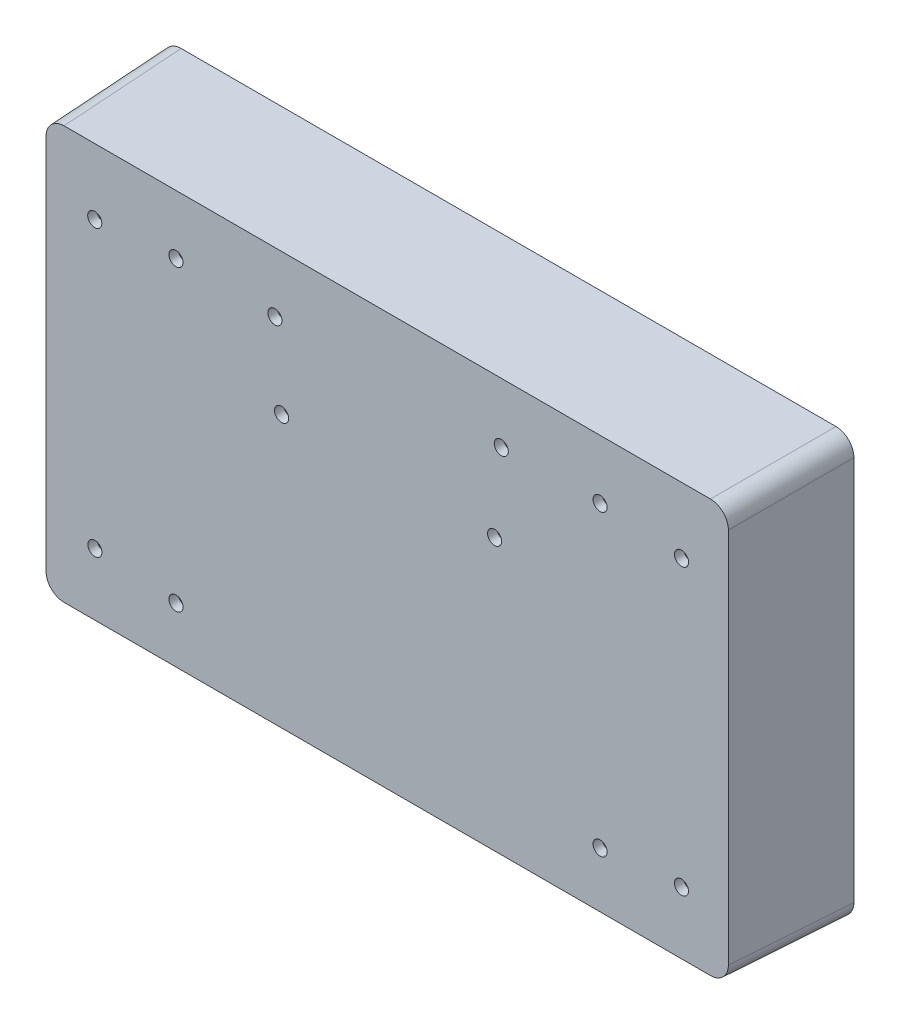
ISO-10303-21;
HEADER;
FILE_DESCRIPTION(('STEP AP214'),'2;1');
FILE_NAME('part.step','',(''),(''),'','','');
FILE_SCHEMA(('AUTOMOTIVE_DESIGN { 1 0 10303 214 1 1 1 1 }'));
ENDSEC;
DATA;
#1=APPLICATION_CONTEXT('core data for automotive mechanical design processes');
#2=APPLICATION_PROTOCOL_DEFINITION('international standard','automotive_design',2000,#1);
#3=PRODUCT_CONTEXT('',#1,'mechanical');
#4=PRODUCT('Part','Part','',(#3));
#5=PRODUCT_RELATED_PRODUCT_CATEGORY('part','',(#4));
#6=PRODUCT_DEFINITION_FORMATION('','',#4);
#7=PRODUCT_DEFINITION_CONTEXT('part definition',#1,'design');
#8=PRODUCT_DEFINITION('design','',#6,#7);
#9=PRODUCT_DEFINITION_SHAPE('','',#8);
#10=(LENGTH_UNIT() NAMED_UNIT(*) SI_UNIT(.MILLI.,.METRE.));
#11=(NAMED_UNIT(*) PLANE_ANGLE_UNIT() SI_UNIT($,.RADIAN.));
#12=(NAMED_UNIT(*) SI_UNIT($,.STERADIAN.) SOLID_ANGLE_UNIT());
#13=UNCERTAINTY_MEASURE_WITH_UNIT(LENGTH_MEASURE(1.E-05),#10,'distance_accuracy_value','');
#14=(GEOMETRIC_REPRESENTATION_CONTEXT(3) GLOBAL_UNCERTAINTY_ASSIGNED_CONTEXT((#13)) GLOBAL_UNIT_ASSIGNED_CONTEXT((#10,
#11,#12)) REPRESENTATION_CONTEXT('',''));
#15=CARTESIAN_POINT('',(0.,0.,0.));
#16=DIRECTION('',(0.,0.,1.));
#17=DIRECTION('',(1.,0.,0.));
#18=AXIS2_PLACEMENT_3D('',#15,#16,#17);
#19=CARTESIAN_POINT('',(0.,0.,-25.));
#20=DIRECTION('',(0.,0.,-1.));
#21=DIRECTION('',(-1.,0.,0.));
#22=AXIS2_PLACEMENT_3D('',#19,#20,#21);
#23=PLANE('',#22);
#24=DIRECTION('',(0.,-1.,0.));
#25=VECTOR('',#24,1.);
#26=CARTESIAN_POINT('',(-116.892916686668,62.4878318939366,-25.));
#27=LINE('',#26,#25);
#28=CARTESIAN_POINT('',(-116.892916686668,61.3645069117516,-25.));
#29=VERTEX_POINT('',#28);
#30=CARTESIAN_POINT('',(-116.892916686668,-24.3888431238783,-25.));
#31=VERTEX_POINT('',#30);
#32=EDGE_CURVE('E125',#29,#31,#27,.T.);
#33=ORIENTED_EDGE('',*,*,#32,.F.);
#34=CARTESIAN_POINT('',(-112.890478509472,61.3596320426327,-25.));
#35=DIRECTION('',(0.,0.,-1.));
#36=DIRECTION('',(0.707106781186548,-0.707106781186547,0.));
#37=AXIS2_PLACEMENT_3D('',#34,#35,#36);
#38=ELLIPSE('',#37,4.00487487002287,4.);
#39=CARTESIAN_POINT('',(-112.895353378591,65.362070219828,-25.));
#40=VERTEX_POINT('',#39);
#41=EDGE_CURVE('E107',#29,#40,#38,.T.);
#42=ORIENTED_EDGE('',*,*,#41,.T.);
#43=DIRECTION('',(-1.,0.,0.));
#44=VECTOR('',#43,1.);
#45=CARTESIAN_POINT('',(33.9813216392236,65.362070219828,-25.));
#46=LINE('',#45,#44);
#47=CARTESIAN_POINT('',(32.8579966570386,65.362070219828,-25.));
#48=VERTEX_POINT('',#47);
#49=EDGE_CURVE('E111',#48,#40,#46,.T.);
#50=ORIENTED_EDGE('',*,*,#49,.F.);
#51=CARTESIAN_POINT('',(32.8531217879197,61.3596320426327,-25.));
#52=DIRECTION('',(0.,0.,-1.));
#53=DIRECTION('',(-0.707106781186547,-0.707106781186548,0.));
#54=AXIS2_PLACEMENT_3D('',#51,#52,#53);
#55=ELLIPSE('',#54,4.00487487002287,4.);
#56=CARTESIAN_POINT('',(36.8555599651149,61.3645069117516,-25.));
#57=VERTEX_POINT('',#56);
#58=EDGE_CURVE('E91',#48,#57,#55,.T.);
#59=ORIENTED_EDGE('',*,*,#58,.T.);
#60=DIRECTION('',(0.,1.,0.));
#61=VECTOR('',#60,1.);
#62=CARTESIAN_POINT('',(36.8555599651149,62.4878318939367,-25.));
#63=LINE('',#62,#61);
#64=CARTESIAN_POINT('',(36.855559965115,-24.3888431238783,-25.));
#65=VERTEX_POINT('',#64);
#66=EDGE_CURVE('E100',#65,#57,#63,.T.);
#67=ORIENTED_EDGE('',*,*,#66,.F.);
#68=CARTESIAN_POINT('',(32.8531217879197,-24.3839682547594,-25.));
#69=DIRECTION('',(0.,0.,-1.));
#70=DIRECTION('',(-0.707106781186548,0.707106781186547,0.));
#71=AXIS2_PLACEMENT_3D('',#68,#69,#70);
#72=ELLIPSE('',#71,4.00487487002287,4.);
#73=CARTESIAN_POINT('',(32.8579966570386,-28.3864064319547,-25.));
#74=VERTEX_POINT('',#73);
#75=EDGE_CURVE('E65',#65,#74,#72,.T.);
#76=ORIENTED_EDGE('',*,*,#75,.T.);
#77=DIRECTION('',(1.,0.,0.));
#78=VECTOR('',#77,1.);
#79=CARTESIAN_POINT('',(33.9813216392236,-28.3864064319547,-25.));
#80=LINE('',#79,#78);
#81=CARTESIAN_POINT('',(-112.895353378591,-28.3864064319547,-25.));
#82=VERTEX_POINT('',#81);
#83=EDGE_CURVE('E123',#82,#74,#80,.T.);
#84=ORIENTED_EDGE('',*,*,#83,.F.);
#85=CARTESIAN_POINT('',(-112.890478509472,-24.3839682547594,-25.));
#86=DIRECTION('',(0.,0.,-1.));
#87=DIRECTION('',(0.707106781186547,0.707106781186548,0.));
#88=AXIS2_PLACEMENT_3D('',#85,#86,#87);
#89=ELLIPSE('',#88,4.00487487002287,4.);
#90=EDGE_CURVE('E116',#82,#31,#89,.T.);
#91=ORIENTED_EDGE('',*,*,#90,.T.);
#92=EDGE_LOOP('',(#33,#42,#50,#59,#67,#76,#84,#91));
#93=FACE_BOUND('',#92,.T.);
#94=CARTESIAN_POINT('',(-112.890478509472,61.3596320426327,-25.));
#95=DIRECTION('',(0.,0.,-1.));
#96=DIRECTION('',(0.707106781186548,-0.707106781186547,0.));
#97=AXIS2_PLACEMENT_3D('',#94,#95,#96);
#98=ELLIPSE('',#97,2.00243743501143,2.);
#99=CARTESIAN_POINT('',(-114.89169759807,61.3620694771921,-25.));
#100=VERTEX_POINT('',#99);
#101=CARTESIAN_POINT('',(-112.892915944032,63.3608511312303,-25.));
#102=VERTEX_POINT('',#101);
#103=EDGE_CURVE('E322',#100,#102,#98,.T.);
#104=ORIENTED_EDGE('',*,*,#103,.F.);
#105=DIRECTION('',(0.,-1.,0.));
#106=VECTOR('',#105,1.);
#107=CARTESIAN_POINT('',(-114.89169759807,62.4878318939366,-25.));
#108=LINE('',#107,#106);
#109=CARTESIAN_POINT('',(-114.89169759807,-24.3864056893188,-25.));
#110=VERTEX_POINT('',#109);
#111=EDGE_CURVE('E303',#100,#110,#108,.T.);
#112=ORIENTED_EDGE('',*,*,#111,.T.);
#113=CARTESIAN_POINT('',(-112.890478509472,-24.3839682547594,-25.));
#114=DIRECTION('',(0.,0.,-1.));
#115=DIRECTION('',(0.707106781186547,0.707106781186548,0.));
#116=AXIS2_PLACEMENT_3D('',#113,#114,#115);
#117=ELLIPSE('',#116,2.00243743501143,2.);
#118=CARTESIAN_POINT('',(-112.892915944032,-26.3851873433571,-25.));
#119=VERTEX_POINT('',#118);
#120=EDGE_CURVE('E316',#119,#110,#117,.T.);
#121=ORIENTED_EDGE('',*,*,#120,.F.);
#122=DIRECTION('',(1.,0.,0.));
#123=VECTOR('',#122,1.);
#124=CARTESIAN_POINT('',(33.9813216392236,-26.385187343357,-25.));
#125=LINE('',#124,#123);
#126=CARTESIAN_POINT('',(32.8555592224791,-26.385187343357,-25.));
#127=VERTEX_POINT('',#126);
#128=EDGE_CURVE('E56',#119,#127,#125,.T.);
#129=ORIENTED_EDGE('',*,*,#128,.T.);
#130=CARTESIAN_POINT('',(32.8531217879197,-24.3839682547594,-25.));
#131=DIRECTION('',(0.,0.,-1.));
#132=DIRECTION('',(-0.707106781186548,0.707106781186547,0.));
#133=AXIS2_PLACEMENT_3D('',#130,#131,#132);
#134=ELLIPSE('',#133,2.00243743501143,2.);
#135=CARTESIAN_POINT('',(34.8543408765173,-24.3864056893188,-25.));
#136=VERTEX_POINT('',#135);
#137=EDGE_CURVE('E318',#136,#127,#134,.T.);
#138=ORIENTED_EDGE('',*,*,#137,.F.);
#139=DIRECTION('',(0.,1.,0.));
#140=VECTOR('',#139,1.);
#141=CARTESIAN_POINT('',(34.8543408765173,62.4878318939367,-25.));
#142=LINE('',#141,#140);
#143=CARTESIAN_POINT('',(34.8543408765173,61.3620694771922,-25.));
#144=VERTEX_POINT('',#143);
#145=EDGE_CURVE('E336',#136,#144,#142,.T.);
#146=ORIENTED_EDGE('',*,*,#145,.T.);
#147=CARTESIAN_POINT('',(32.8531217879197,61.3596320426327,-25.));
#148=DIRECTION('',(0.,0.,-1.));
#149=DIRECTION('',(-0.707106781186547,-0.707106781186548,0.));
#150=AXIS2_PLACEMENT_3D('',#147,#148,#149);
#151=ELLIPSE('',#150,2.00243743501143,2.);
#152=CARTESIAN_POINT('',(32.8555592224791,63.3608511312303,-25.));
#153=VERTEX_POINT('',#152);
#154=EDGE_CURVE('E320',#153,#144,#151,.T.);
#155=ORIENTED_EDGE('',*,*,#154,.F.);
#156=DIRECTION('',(-1.,0.,0.));
#157=VECTOR('',#156,1.);
#158=CARTESIAN_POINT('',(33.9813216392236,63.3608511312303,-25.));
#159=LINE('',#158,#157);
#160=EDGE_CURVE('E297',#153,#102,#159,.T.);
#161=ORIENTED_EDGE('',*,*,#160,.T.);
#162=EDGE_LOOP('',(#104,#112,#121,#129,#138,#146,#155,#161));
#163=FACE_BOUND('',#162,.T.);
#164=ADVANCED_FACE('F39',(#93,#163),#23,.T.);
#165=CARTESIAN_POINT('',(7.36496173957907,51.2890967809271,0.));
#166=DIRECTION('',(0.,0.,1.));
#167=DIRECTION('',(1.,0.,0.));
#168=AXIS2_PLACEMENT_3D('',#165,#166,#167);
#169=CONICAL_SURFACE('',#168,1.5,0.0349065850398867);
#170=CARTESIAN_POINT('',(7.36496173957907,51.2890967809271,2.));
#171=DIRECTION('',(0.,0.,-1.));
#172=DIRECTION('',(-1.,0.,0.));
#173=AXIS2_PLACEMENT_3D('',#170,#171,#172);
#174=CIRCLE('',#173,1.5698415389835);
#175=CARTESIAN_POINT('',(5.79512020059557,51.2890967809271,2.));
#176=VERTEX_POINT('',#175);
#177=EDGE_CURVE('E43',#176,#176,#174,.F.);
#178=ORIENTED_EDGE('',*,*,#177,.T.);
#179=EDGE_LOOP('',(#178));
#180=FACE_BOUND('',#179,.T.);
#181=CARTESIAN_POINT('',(7.36496173957907,51.2890967809271,0.));
#182=DIRECTION('',(0.,0.,1.));
#183=DIRECTION('',(1.,0.,0.));
#184=AXIS2_PLACEMENT_3D('',#181,#182,#183);
#185=CIRCLE('',#184,1.5);
#186=CARTESIAN_POINT('',(8.86496173957907,51.2890967809271,0.));
#187=VERTEX_POINT('',#186);
#188=EDGE_CURVE('E350',#187,#187,#185,.T.);
#189=ORIENTED_EDGE('',*,*,#188,.F.);
#190=EDGE_LOOP('',(#189));
#191=FACE_BOUND('',#190,.T.);
#192=ADVANCED_FACE('F407',(#180,#191),#169,.F.);
#193=CARTESIAN_POINT('',(25.4912621339343,49.7762168707705,0.));
#194=DIRECTION('',(0.,0.,1.));
#195=DIRECTION('',(1.,0.,0.));
#196=AXIS2_PLACEMENT_3D('',#193,#194,#195);
#197=CONICAL_SURFACE('',#196,1.5,0.0349065850398867);
#198=CARTESIAN_POINT('',(25.4912621339343,49.7762168707705,2.));
#199=DIRECTION('',(0.,0.,-1.));
#200=DIRECTION('',(-1.,0.,0.));
#201=AXIS2_PLACEMENT_3D('',#198,#199,#200);
#202=CIRCLE('',#201,1.5698415389835);
#203=CARTESIAN_POINT('',(23.9214205949508,49.7762168707705,2.));
#204=VERTEX_POINT('',#203);
#205=EDGE_CURVE('E162',#204,#204,#202,.F.);
#206=ORIENTED_EDGE('',*,*,#205,.T.);
#207=EDGE_LOOP('',(#206));
#208=FACE_BOUND('',#207,.T.);
#209=CARTESIAN_POINT('',(25.4912621339343,49.7762168707705,0.));
#210=DIRECTION('',(0.,0.,1.));
#211=DIRECTION('',(1.,0.,0.));
#212=AXIS2_PLACEMENT_3D('',#209,#210,#211);
#213=CIRCLE('',#212,1.5);
#214=CARTESIAN_POINT('',(26.9912621339343,49.7762168707705,0.));
#215=VERTEX_POINT('',#214);
#216=EDGE_CURVE('E353',#215,#215,#213,.T.);
#217=ORIENTED_EDGE('',*,*,#216,.F.);
#218=EDGE_LOOP('',(#217));
#219=FACE_BOUND('',#218,.T.);
#220=ADVANCED_FACE('F411',(#208,#219),#197,.F.);
#221=CARTESIAN_POINT('',(25.4716632373435,-13.6234666523832,0.));
#222=DIRECTION('',(0.,0.,1.));
#223=DIRECTION('',(1.,0.,0.));
#224=AXIS2_PLACEMENT_3D('',#221,#222,#223);
#225=CONICAL_SURFACE('',#224,1.5,0.0349065850398867);
#226=CARTESIAN_POINT('',(25.4716632373435,-13.6234666523832,2.));
#227=DIRECTION('',(0.,0.,-1.));
#228=DIRECTION('',(-1.,0.,0.));
#229=AXIS2_PLACEMENT_3D('',#226,#227,#228);
#230=CIRCLE('',#229,1.5698415389835);
#231=CARTESIAN_POINT('',(23.90182169836,-13.6234666523832,2.));
#232=VERTEX_POINT('',#231);
#233=EDGE_CURVE('E160',#232,#232,#230,.F.);
#234=ORIENTED_EDGE('',*,*,#233,.T.);
#235=EDGE_LOOP('',(#234));
#236=FACE_BOUND('',#235,.T.);
#237=CARTESIAN_POINT('',(25.4716632373435,-13.6234666523832,0.));
#238=DIRECTION('',(0.,0.,1.));
#239=DIRECTION('',(1.,0.,0.));
#240=AXIS2_PLACEMENT_3D('',#237,#238,#239);
#241=CIRCLE('',#240,1.5);
#242=CARTESIAN_POINT('',(26.9716632373435,-13.6234666523832,0.));
#243=VERTEX_POINT('',#242);
#244=EDGE_CURVE('E358',#243,#243,#241,.T.);
#245=ORIENTED_EDGE('',*,*,#244,.F.);
#246=EDGE_LOOP('',(#245));
#247=FACE_BOUND('',#246,.T.);
#248=ADVANCED_FACE('F527',(#236,#247),#225,.F.);
#249=CARTESIAN_POINT('',(7.36496173957907,-15.1280482620583,0.));
#250=DIRECTION('',(0.,0.,1.));
#251=DIRECTION('',(1.,0.,0.));
#252=AXIS2_PLACEMENT_3D('',#249,#250,#251);
#253=CONICAL_SURFACE('',#252,1.5,0.0349065850398867);
#254=CARTESIAN_POINT('',(7.36496173957907,-15.1280482620583,2.));
#255=DIRECTION('',(0.,0.,-1.));
#256=DIRECTION('',(-1.,0.,0.));
#257=AXIS2_PLACEMENT_3D('',#254,#255,#256);
#258=CIRCLE('',#257,1.5698415389835);
#259=CARTESIAN_POINT('',(5.79512020059557,-15.1280482620583,2.));
#260=VERTEX_POINT('',#259);
#261=EDGE_CURVE('E157',#260,#260,#258,.F.);
#262=ORIENTED_EDGE('',*,*,#261,.T.);
#263=EDGE_LOOP('',(#262));
#264=FACE_BOUND('',#263,.T.);
#265=CARTESIAN_POINT('',(7.36496173957907,-15.1280482620583,0.));
#266=DIRECTION('',(0.,0.,1.));
#267=DIRECTION('',(1.,0.,0.));
#268=AXIS2_PLACEMENT_3D('',#265,#266,#267);
#269=CIRCLE('',#268,1.5);
#270=CARTESIAN_POINT('',(8.86496173957907,-15.1280482620583,0.));
#271=VERTEX_POINT('',#270);
#272=EDGE_CURVE('E361',#271,#271,#269,.T.);
#273=ORIENTED_EDGE('',*,*,#272,.F.);
#274=EDGE_LOOP('',(#273));
#275=FACE_BOUND('',#274,.T.);
#276=ADVANCED_FACE('F537',(#264,#275),#253,.F.);
#277=CARTESIAN_POINT('',(-14.6335821702918,51.078679059881,0.));
#278=DIRECTION('',(0.,0.,1.));
#279=DIRECTION('',(1.,0.,0.));
#280=AXIS2_PLACEMENT_3D('',#277,#278,#279);
#281=CONICAL_SURFACE('',#280,1.5,0.0349065850398867);
#282=CARTESIAN_POINT('',(-14.6335821702918,51.078679059881,2.));
#283=DIRECTION('',(0.,0.,-1.));
#284=DIRECTION('',(-1.,0.,0.));
#285=AXIS2_PLACEMENT_3D('',#282,#283,#284);
#286=CIRCLE('',#285,1.5698415389835);
#287=CARTESIAN_POINT('',(-16.2034237092753,51.078679059881,2.));
#288=VERTEX_POINT('',#287);
#289=EDGE_CURVE('E154',#288,#288,#286,.F.);
#290=ORIENTED_EDGE('',*,*,#289,.T.);
#291=EDGE_LOOP('',(#290));
#292=FACE_BOUND('',#291,.T.);
#293=CARTESIAN_POINT('',(-14.6335821702918,51.078679059881,0.));
#294=DIRECTION('',(0.,0.,1.));
#295=DIRECTION('',(1.,0.,0.));
#296=AXIS2_PLACEMENT_3D('',#293,#294,#295);
#297=CIRCLE('',#296,1.5);
#298=CARTESIAN_POINT('',(-13.1335821702918,51.078679059881,0.));
#299=VERTEX_POINT('',#298);
#300=EDGE_CURVE('E364',#299,#299,#297,.T.);
#301=ORIENTED_EDGE('',*,*,#300,.F.);
#302=EDGE_LOOP('',(#301));
#303=FACE_BOUND('',#302,.T.);
#304=ADVANCED_FACE('F548',(#292,#303),#281,.F.);
#305=CARTESIAN_POINT('',(-16.1161915234905,32.9981485892766,0.));
#306=DIRECTION('',(0.,0.,1.));
#307=DIRECTION('',(1.,0.,0.));
#308=AXIS2_PLACEMENT_3D('',#305,#306,#307);
#309=CONICAL_SURFACE('',#308,1.5,0.0349065850398867);
#310=CARTESIAN_POINT('',(-16.1161915234905,32.9981485892766,2.));
#311=DIRECTION('',(0.,0.,-1.));
#312=DIRECTION('',(-1.,0.,0.));
#313=AXIS2_PLACEMENT_3D('',#310,#311,#312);
#314=CIRCLE('',#313,1.5698415389835);
#315=CARTESIAN_POINT('',(-17.686033062474,32.9981485892766,2.));
#316=VERTEX_POINT('',#315);
#317=EDGE_CURVE('E151',#316,#316,#314,.F.);
#318=ORIENTED_EDGE('',*,*,#317,.T.);
#319=EDGE_LOOP('',(#318));
#320=FACE_BOUND('',#319,.T.);
#321=CARTESIAN_POINT('',(-16.1161915234905,32.9981485892766,0.));
#322=DIRECTION('',(0.,0.,1.));
#323=DIRECTION('',(1.,0.,0.));
#324=AXIS2_PLACEMENT_3D('',#321,#322,#323);
#325=CIRCLE('',#324,1.5);
#326=CARTESIAN_POINT('',(-14.6161915234905,32.9981485892766,0.));
#327=VERTEX_POINT('',#326);
#328=EDGE_CURVE('E367',#327,#327,#325,.T.);
#329=ORIENTED_EDGE('',*,*,#328,.F.);
#330=EDGE_LOOP('',(#329));
#331=FACE_BOUND('',#330,.T.);
#332=ADVANCED_FACE('F559',(#320,#331),#309,.F.);
#333=CARTESIAN_POINT('',(-65.0188938697197,51.078679059881,0.));
#334=DIRECTION('',(0.,0.,1.));
#335=DIRECTION('',(1.,0.,0.));
#336=AXIS2_PLACEMENT_3D('',#333,#334,#335);
#337=CONICAL_SURFACE('',#336,1.5,0.0349065850398867);
#338=CARTESIAN_POINT('',(-65.0188938697197,51.078679059881,2.));
#339=DIRECTION('',(0.,0.,-1.));
#340=DIRECTION('',(-1.,0.,0.));
#341=AXIS2_PLACEMENT_3D('',#338,#339,#340);
#342=CIRCLE('',#341,1.56984153898349);
#343=CARTESIAN_POINT('',(-66.5887354087032,51.078679059881,2.));
#344=VERTEX_POINT('',#343);
#345=EDGE_CURVE('E148',#344,#344,#342,.F.);
#346=ORIENTED_EDGE('',*,*,#345,.T.);
#347=EDGE_LOOP('',(#346));
#348=FACE_BOUND('',#347,.T.);
#349=CARTESIAN_POINT('',(-65.0188938697197,51.078679059881,0.));
#350=DIRECTION('',(0.,0.,1.));
#351=DIRECTION('',(1.,0.,0.));
#352=AXIS2_PLACEMENT_3D('',#349,#350,#351);
#353=CIRCLE('',#352,1.5);
#354=CARTESIAN_POINT('',(-63.5188938697197,51.078679059881,0.));
#355=VERTEX_POINT('',#354);
#356=EDGE_CURVE('E370',#355,#355,#353,.T.);
#357=ORIENTED_EDGE('',*,*,#356,.F.);
#358=EDGE_LOOP('',(#357));
#359=FACE_BOUND('',#358,.T.);
#360=ADVANCED_FACE('F570',(#348,#359),#337,.F.);
#361=CARTESIAN_POINT('',(-63.5349698763937,32.9981485892766,0.));
#362=DIRECTION('',(0.,0.,1.));
#363=DIRECTION('',(1.,0.,0.));
#364=AXIS2_PLACEMENT_3D('',#361,#362,#363);
#365=CONICAL_SURFACE('',#364,1.5,0.0349065850398867);
#366=CARTESIAN_POINT('',(-63.5349698763937,32.9981485892766,2.));
#367=DIRECTION('',(0.,0.,-1.));
#368=DIRECTION('',(-1.,0.,0.));
#369=AXIS2_PLACEMENT_3D('',#366,#367,#368);
#370=CIRCLE('',#369,1.5698415389835);
#371=CARTESIAN_POINT('',(-65.1048114153772,32.9981485892766,2.));
#372=VERTEX_POINT('',#371);
#373=EDGE_CURVE('E145',#372,#372,#370,.F.);
#374=ORIENTED_EDGE('',*,*,#373,.T.);
#375=EDGE_LOOP('',(#374));
#376=FACE_BOUND('',#375,.T.);
#377=CARTESIAN_POINT('',(-63.5349698763937,32.9981485892766,0.));
#378=DIRECTION('',(0.,0.,1.));
#379=DIRECTION('',(1.,0.,0.));
#380=AXIS2_PLACEMENT_3D('',#377,#378,#379);
#381=CIRCLE('',#380,1.5);
#382=CARTESIAN_POINT('',(-62.0349698763937,32.9981485892766,0.));
#383=VERTEX_POINT('',#382);
#384=EDGE_CURVE('E373',#383,#383,#381,.T.);
#385=ORIENTED_EDGE('',*,*,#384,.F.);
#386=EDGE_LOOP('',(#385));
#387=FACE_BOUND('',#386,.T.);
#388=ADVANCED_FACE('F581',(#376,#387),#365,.F.);
#389=CARTESIAN_POINT('',(-87.0371998457483,51.2890967809271,0.));
#390=DIRECTION('',(0.,0.,1.));
#391=DIRECTION('',(1.,0.,0.));
#392=AXIS2_PLACEMENT_3D('',#389,#390,#391);
#393=CONICAL_SURFACE('',#392,1.5,0.0349065850398867);
#394=CARTESIAN_POINT('',(-87.0371998457483,51.2890967809271,2.));
#395=DIRECTION('',(0.,0.,-1.));
#396=DIRECTION('',(-1.,0.,0.));
#397=AXIS2_PLACEMENT_3D('',#394,#395,#396);
#398=CIRCLE('',#397,1.56984153898349);
#399=CARTESIAN_POINT('',(-88.6070413847318,51.2890967809271,2.));
#400=VERTEX_POINT('',#399);
#401=EDGE_CURVE('E142',#400,#400,#398,.F.);
#402=ORIENTED_EDGE('',*,*,#401,.T.);
#403=EDGE_LOOP('',(#402));
#404=FACE_BOUND('',#403,.T.);
#405=CARTESIAN_POINT('',(-87.0371998457483,51.2890967809271,0.));
#406=DIRECTION('',(0.,0.,1.));
#407=DIRECTION('',(1.,0.,0.));
#408=AXIS2_PLACEMENT_3D('',#405,#406,#407);
#409=CIRCLE('',#408,1.5);
#410=CARTESIAN_POINT('',(-85.5371998457483,51.2890967809271,0.));
#411=VERTEX_POINT('',#410);
#412=EDGE_CURVE('E376',#411,#411,#409,.T.);
#413=ORIENTED_EDGE('',*,*,#412,.F.);
#414=EDGE_LOOP('',(#413));
#415=FACE_BOUND('',#414,.T.);
#416=ADVANCED_FACE('F592',(#404,#415),#393,.F.);
#417=CARTESIAN_POINT('',(-105.122155179384,49.7762168707705,0.));
#418=DIRECTION('',(0.,0.,1.));
#419=DIRECTION('',(1.,0.,0.));
#420=AXIS2_PLACEMENT_3D('',#417,#418,#419);
#421=CONICAL_SURFACE('',#420,1.5,0.0349065850398867);
#422=CARTESIAN_POINT('',(-105.122155179384,49.7762168707705,2.));
#423=DIRECTION('',(0.,0.,-1.));
#424=DIRECTION('',(-1.,0.,0.));
#425=AXIS2_PLACEMENT_3D('',#422,#423,#424);
#426=CIRCLE('',#425,1.56984153898349);
#427=CARTESIAN_POINT('',(-106.691996718367,49.7762168707705,2.));
#428=VERTEX_POINT('',#427);
#429=EDGE_CURVE('E139',#428,#428,#426,.F.);
#430=ORIENTED_EDGE('',*,*,#429,.T.);
#431=EDGE_LOOP('',(#430));
#432=FACE_BOUND('',#431,.T.);
#433=CARTESIAN_POINT('',(-105.122155179384,49.7762168707705,0.));
#434=DIRECTION('',(0.,0.,1.));
#435=DIRECTION('',(1.,0.,0.));
#436=AXIS2_PLACEMENT_3D('',#433,#434,#435);
#437=CIRCLE('',#436,1.5);
#438=CARTESIAN_POINT('',(-103.622155179384,49.7762168707705,0.));
#439=VERTEX_POINT('',#438);
#440=EDGE_CURVE('E379',#439,#439,#437,.T.);
#441=ORIENTED_EDGE('',*,*,#440,.F.);
#442=EDGE_LOOP('',(#441));
#443=FACE_BOUND('',#442,.T.);
#444=ADVANCED_FACE('F402',(#432,#443),#421,.F.);
#445=CARTESIAN_POINT('',(-87.0371998457483,-15.1280482620583,0.));
#446=DIRECTION('',(0.,0.,1.));
#447=DIRECTION('',(1.,0.,0.));
#448=AXIS2_PLACEMENT_3D('',#445,#446,#447);
#449=CONICAL_SURFACE('',#448,1.5,0.0349065850398867);
#450=CARTESIAN_POINT('',(-87.0371998457483,-15.1280482620583,2.));
#451=DIRECTION('',(0.,0.,-1.));
#452=DIRECTION('',(-1.,0.,0.));
#453=AXIS2_PLACEMENT_3D('',#450,#451,#452);
#454=CIRCLE('',#453,1.56984153898349);
#455=CARTESIAN_POINT('',(-88.6070413847318,-15.1280482620583,2.));
#456=VERTEX_POINT('',#455);
#457=EDGE_CURVE('E135',#456,#456,#454,.F.);
#458=ORIENTED_EDGE('',*,*,#457,.T.);
#459=EDGE_LOOP('',(#458));
#460=FACE_BOUND('',#459,.T.);
#461=CARTESIAN_POINT('',(-87.0371998457483,-15.1280482620583,0.));
#462=DIRECTION('',(0.,0.,1.));
#463=DIRECTION('',(1.,0.,0.));
#464=AXIS2_PLACEMENT_3D('',#461,#462,#463);
#465=CIRCLE('',#464,1.5);
#466=CARTESIAN_POINT('',(-85.5371998457483,-15.1280482620583,0.));
#467=VERTEX_POINT('',#466);
#468=EDGE_CURVE('E382',#467,#467,#465,.T.);
#469=ORIENTED_EDGE('',*,*,#468,.F.);
#470=EDGE_LOOP('',(#469));
#471=FACE_BOUND('',#470,.T.);
#472=ADVANCED_FACE('F393',(#460,#471),#449,.F.);
#473=CARTESIAN_POINT('',(-105.094004445807,-13.6234666523832,0.));
#474=DIRECTION('',(0.,0.,1.));
#475=DIRECTION('',(1.,0.,0.));
#476=AXIS2_PLACEMENT_3D('',#473,#474,#475);
#477=CONICAL_SURFACE('',#476,1.5,0.0349065850398867);
#478=CARTESIAN_POINT('',(-105.094004445807,-13.6234666523832,2.));
#479=DIRECTION('',(0.,0.,-1.));
#480=DIRECTION('',(-1.,0.,0.));
#481=AXIS2_PLACEMENT_3D('',#478,#479,#480);
#482=CIRCLE('',#481,1.56984153898349);
#483=CARTESIAN_POINT('',(-106.66384598479,-13.6234666523832,2.));
#484=VERTEX_POINT('',#483);
#485=EDGE_CURVE('E132',#484,#484,#482,.F.);
#486=ORIENTED_EDGE('',*,*,#485,.T.);
#487=EDGE_LOOP('',(#486));
#488=FACE_BOUND('',#487,.T.);
#489=CARTESIAN_POINT('',(-105.094004445807,-13.6234666523832,0.));
#490=DIRECTION('',(0.,0.,1.));
#491=DIRECTION('',(1.,0.,0.));
#492=AXIS2_PLACEMENT_3D('',#489,#490,#491);
#493=CIRCLE('',#492,1.5);
#494=CARTESIAN_POINT('',(-103.594004445807,-13.6234666523832,0.));
#495=VERTEX_POINT('',#494);
#496=EDGE_CURVE('E385',#495,#495,#493,.T.);
#497=ORIENTED_EDGE('',*,*,#496,.F.);
#498=EDGE_LOOP('',(#497));
#499=FACE_BOUND('',#498,.T.);
#500=ADVANCED_FACE('F391',(#488,#499),#477,.F.);
#501=CARTESIAN_POINT('',(35.9801032932618,62.4878318939367,0.0697989934050021));
#502=DIRECTION('',(0.999390827019096,0.,0.034899496702501));
#503=DIRECTION('',(0.034899496702501,0.,-0.999390827019096));
#504=AXIS2_PLACEMENT_3D('',#501,#502,#503);
#505=PLANE('',#504);
#506=ORIENTED_EDGE('',*,*,#66,.T.);
#507=DIRECTION('',(-0.0348782627423747,-0.0348782627423747,0.998782765958718));
#508=VECTOR('',#507,1.);
#509=CARTESIAN_POINT('',(35.9825347975761,60.4914817442127,0.000169820003353039));
#510=LINE('',#509,#508);
#511=CARTESIAN_POINT('',(35.9126991888378,60.4216461354744,2.));
#512=VERTEX_POINT('',#511);
#513=EDGE_CURVE('E106',#57,#512,#510,.T.);
#514=ORIENTED_EDGE('',*,*,#513,.T.);
#515=DIRECTION('',(0.,1.,0.));
#516=VECTOR('',#515,1.);
#517=CARTESIAN_POINT('',(35.9126991888377,62.4878318939367,2.));
#518=LINE('',#517,#516);
#519=CARTESIAN_POINT('',(35.9126991888378,-23.4459823476011,2.));
#520=VERTEX_POINT('',#519);
#521=EDGE_CURVE('E103',#520,#512,#518,.T.);
#522=ORIENTED_EDGE('',*,*,#521,.F.);
#523=DIRECTION('',(-0.0348782627423747,0.0348782627423747,0.998782765958718));
#524=VECTOR('',#523,1.);
#525=CARTESIAN_POINT('',(35.9825347975761,-23.5158179563394,0.000169820003353825));
#526=LINE('',#525,#524);
#527=EDGE_CURVE('E97',#520,#65,#526,.F.);
#528=ORIENTED_EDGE('',*,*,#527,.T.);
#529=EDGE_LOOP('',(#506,#514,#522,#528));
#530=FACE_BOUND('',#529,.T.);
#531=ADVANCED_FACE('F98',(#530),#505,.T.);
#532=CARTESIAN_POINT('',(33.9813216392236,-27.5109497601015,0.0697989934050021));
#533=DIRECTION('',(0.,-0.999390827019096,0.034899496702501));
#534=DIRECTION('',(0.,-0.034899496702501,-0.999390827019096));
#535=AXIS2_PLACEMENT_3D('',#532,#533,#534);
#536=PLANE('',#535);
#537=ORIENTED_EDGE('',*,*,#83,.T.);
#538=DIRECTION('',(-0.0348782627423747,0.0348782627423747,0.998782765958718));
#539=VECTOR('',#538,1.);
#540=CARTESIAN_POINT('',(31.9849714894997,-27.5133812644158,0.000169820003353066));
#541=LINE('',#540,#539);
#542=CARTESIAN_POINT('',(31.9151358807614,-27.4435456556775,2.));
#543=VERTEX_POINT('',#542);
#544=EDGE_CURVE('E11',#74,#543,#541,.T.);
#545=ORIENTED_EDGE('',*,*,#544,.T.);
#546=DIRECTION('',(1.,0.,0.));
#547=VECTOR('',#546,1.);
#548=CARTESIAN_POINT('',(33.9813216392236,-27.4435456556775,2.));
#549=LINE('',#548,#547);
#550=CARTESIAN_POINT('',(-111.952492602314,-27.4435456556775,2.));
#551=VERTEX_POINT('',#550);
#552=EDGE_CURVE('E112',#551,#543,#549,.T.);
#553=ORIENTED_EDGE('',*,*,#552,.F.);
#554=DIRECTION('',(0.0348782627423747,0.0348782627423747,0.998782765958718));
#555=VECTOR('',#554,1.);
#556=CARTESIAN_POINT('',(-111.915276808403,-27.4063298617663,3.06572090056577));
#557=LINE('',#556,#555);
#558=EDGE_CURVE('E48',#551,#82,#557,.F.);
#559=ORIENTED_EDGE('',*,*,#558,.T.);
#560=EDGE_LOOP('',(#537,#545,#553,#559));
#561=FACE_BOUND('',#560,.T.);
#562=ADVANCED_FACE('F400',(#561),#536,.T.);
#563=CARTESIAN_POINT('',(-116.017460014815,62.4878318939366,0.0697989934050021));
#564=DIRECTION('',(-0.999390827019096,0.,0.034899496702501));
#565=DIRECTION('',(0.034899496702501,0.,0.999390827019096));
#566=AXIS2_PLACEMENT_3D('',#563,#564,#565);
#567=PLANE('',#566);
#568=DIRECTION('',(0.,-1.,0.));
#569=VECTOR('',#568,1.);
#570=CARTESIAN_POINT('',(-115.950055910391,62.4878318939366,2.));
#571=LINE('',#570,#569);
#572=CARTESIAN_POINT('',(-115.950055910391,60.4216461354744,2.));
#573=VERTEX_POINT('',#572);
#574=CARTESIAN_POINT('',(-115.950055910391,-23.4459823476011,2.));
#575=VERTEX_POINT('',#574);
#576=EDGE_CURVE('E176',#573,#575,#571,.T.);
#577=ORIENTED_EDGE('',*,*,#576,.F.);
#578=DIRECTION('',(0.0348782627423747,-0.0348782627423747,0.998782765958718));
#579=VECTOR('',#578,1.);
#580=CARTESIAN_POINT('',(-115.839850523764,60.3114407488476,5.15586936458561));
#581=LINE('',#580,#579);
#582=EDGE_CURVE('E119',#573,#29,#581,.F.);
#583=ORIENTED_EDGE('',*,*,#582,.T.);
#584=ORIENTED_EDGE('',*,*,#32,.T.);
#585=DIRECTION('',(0.0348782627423747,0.0348782627423747,0.998782765958718));
#586=VECTOR('',#585,1.);
#587=CARTESIAN_POINT('',(-115.912840116479,-23.40876655369,3.06572090056578));
#588=LINE('',#587,#586);
#589=EDGE_CURVE('E184',#31,#575,#588,.T.);
#590=ORIENTED_EDGE('',*,*,#589,.T.);
#591=EDGE_LOOP('',(#577,#583,#584,#590));
#592=FACE_BOUND('',#591,.T.);
#593=ADVANCED_FACE('F678',(#592),#567,.T.);
#594=CARTESIAN_POINT('',(33.9813216392236,64.4866135479748,0.0697989934050021));
#595=DIRECTION('',(0.,0.999390827019096,0.034899496702501));
#596=DIRECTION('',(0.,-0.034899496702501,0.999390827019096));
#597=AXIS2_PLACEMENT_3D('',#594,#595,#596);
#598=PLANE('',#597);
#599=ORIENTED_EDGE('',*,*,#49,.T.);
#600=DIRECTION('',(0.0348782627423747,-0.0348782627423747,0.998782765958718));
#601=VECTOR('',#600,1.);
#602=CARTESIAN_POINT('',(-111.842287215687,64.309004056924,5.15586936458561));
#603=LINE('',#602,#601);
#604=CARTESIAN_POINT('',(-111.952492602314,64.4192094435508,2.));
#605=VERTEX_POINT('',#604);
#606=EDGE_CURVE('E192',#40,#605,#603,.T.);
#607=ORIENTED_EDGE('',*,*,#606,.T.);
#608=DIRECTION('',(-1.,0.,0.));
#609=VECTOR('',#608,1.);
#610=CARTESIAN_POINT('',(33.9813216392236,64.4192094435508,2.));
#611=LINE('',#610,#609);
#612=CARTESIAN_POINT('',(31.9151358807614,64.4192094435508,2.));
#613=VERTEX_POINT('',#612);
#614=EDGE_CURVE('E169',#613,#605,#611,.T.);
#615=ORIENTED_EDGE('',*,*,#614,.F.);
#616=DIRECTION('',(-0.0348782627423747,-0.0348782627423747,0.998782765958718));
#617=VECTOR('',#616,1.);
#618=CARTESIAN_POINT('',(31.9849714894997,64.4890450522891,0.00016982000335312));
#619=LINE('',#618,#617);
#620=EDGE_CURVE('E124',#613,#48,#619,.F.);
#621=ORIENTED_EDGE('',*,*,#620,.T.);
#622=EDGE_LOOP('',(#599,#607,#615,#621));
#623=FACE_BOUND('',#622,.T.);
#624=ADVANCED_FACE('F205',(#623),#598,.T.);
#625=CARTESIAN_POINT('',(0.,0.,2.));
#626=DIRECTION('',(0.,0.,-1.));
#627=DIRECTION('',(-1.,0.,0.));
#628=AXIS2_PLACEMENT_3D('',#625,#626,#627);
#629=PLANE('',#628);
#630=ORIENTED_EDGE('',*,*,#485,.F.);
#631=EDGE_LOOP('',(#630));
#632=FACE_BOUND('',#631,.T.);
#633=ORIENTED_EDGE('',*,*,#457,.F.);
#634=EDGE_LOOP('',(#633));
#635=FACE_BOUND('',#634,.T.);
#636=ORIENTED_EDGE('',*,*,#429,.F.);
#637=EDGE_LOOP('',(#636));
#638=FACE_BOUND('',#637,.T.);
#639=ORIENTED_EDGE('',*,*,#401,.F.);
#640=EDGE_LOOP('',(#639));
#641=FACE_BOUND('',#640,.T.);
#642=ORIENTED_EDGE('',*,*,#373,.F.);
#643=EDGE_LOOP('',(#642));
#644=FACE_BOUND('',#643,.T.);
#645=ORIENTED_EDGE('',*,*,#345,.F.);
#646=EDGE_LOOP('',(#645));
#647=FACE_BOUND('',#646,.T.);
#648=ORIENTED_EDGE('',*,*,#317,.F.);
#649=EDGE_LOOP('',(#648));
#650=FACE_BOUND('',#649,.T.);
#651=ORIENTED_EDGE('',*,*,#289,.F.);
#652=EDGE_LOOP('',(#651));
#653=FACE_BOUND('',#652,.T.);
#654=ORIENTED_EDGE('',*,*,#261,.F.);
#655=EDGE_LOOP('',(#654));
#656=FACE_BOUND('',#655,.T.);
#657=ORIENTED_EDGE('',*,*,#233,.F.);
#658=EDGE_LOOP('',(#657));
#659=FACE_BOUND('',#658,.T.);
#660=ORIENTED_EDGE('',*,*,#205,.F.);
#661=EDGE_LOOP('',(#660));
#662=FACE_BOUND('',#661,.T.);
#663=ORIENTED_EDGE('',*,*,#177,.F.);
#664=EDGE_LOOP('',(#663));
#665=FACE_BOUND('',#664,.T.);
#666=ORIENTED_EDGE('',*,*,#614,.T.);
#667=CARTESIAN_POINT('',(-111.947617733195,60.4167712663555,2.));
#668=DIRECTION('',(0.,0.,-1.));
#669=DIRECTION('',(0.707106781186548,-0.707106781186547,0.));
#670=AXIS2_PLACEMENT_3D('',#667,#668,#669);
#671=ELLIPSE('',#670,4.00487487002287,4.);
#672=EDGE_CURVE('E181',#605,#573,#671,.F.);
#673=ORIENTED_EDGE('',*,*,#672,.T.);
#674=ORIENTED_EDGE('',*,*,#576,.T.);
#675=CARTESIAN_POINT('',(-111.947617733195,-23.4411074784822,2.));
#676=DIRECTION('',(0.,0.,-1.));
#677=DIRECTION('',(0.707106781186547,0.707106781186548,0.));
#678=AXIS2_PLACEMENT_3D('',#675,#676,#677);
#679=ELLIPSE('',#678,4.00487487002287,4.);
#680=EDGE_CURVE('E188',#575,#551,#679,.F.);
#681=ORIENTED_EDGE('',*,*,#680,.T.);
#682=ORIENTED_EDGE('',*,*,#552,.T.);
#683=CARTESIAN_POINT('',(31.9102610116425,-23.4411074784822,2.));
#684=DIRECTION('',(0.,0.,-1.));
#685=DIRECTION('',(-0.707106781186548,0.707106781186547,0.));
#686=AXIS2_PLACEMENT_3D('',#683,#684,#685);
#687=ELLIPSE('',#686,4.00487487002287,4.);
#688=EDGE_CURVE('E191',#543,#520,#687,.F.);
#689=ORIENTED_EDGE('',*,*,#688,.T.);
#690=ORIENTED_EDGE('',*,*,#521,.T.);
#691=CARTESIAN_POINT('',(31.9102610116425,60.4167712663555,2.));
#692=DIRECTION('',(0.,0.,-1.));
#693=DIRECTION('',(-0.707106781186547,-0.707106781186548,0.));
#694=AXIS2_PLACEMENT_3D('',#691,#692,#693);
#695=ELLIPSE('',#694,4.00487487002287,4.);
#696=EDGE_CURVE('E185',#512,#613,#695,.F.);
#697=ORIENTED_EDGE('',*,*,#696,.T.);
#698=EDGE_LOOP('',(#666,#673,#674,#681,#682,#689,#690,#697));
#699=FACE_BOUND('',#698,.T.);
#700=ADVANCED_FACE('F659',(#632,#635,#638,#641,#644,#647,#650,#653,#656,#659,#662,#665,#699),
#629,.F.);
#701=CARTESIAN_POINT('',(-111.842287215687,60.3114407488476,5.01627137777561));
#702=DIRECTION('',(0.0348782627423747,-0.0348782627423747,0.998782765958718));
#703=DIRECTION('',(0.999390827019096,0.,-0.0348994967025011));
#704=AXIS2_PLACEMENT_3D('',#701,#702,#703);
#705=CYLINDRICAL_SURFACE('',#704,4.);
#706=ORIENTED_EDGE('',*,*,#41,.F.);
#707=ORIENTED_EDGE('',*,*,#582,.F.);
#708=ORIENTED_EDGE('',*,*,#672,.F.);
#709=ORIENTED_EDGE('',*,*,#606,.F.);
#710=EDGE_LOOP('',(#706,#707,#708,#709));
#711=FACE_BOUND('',#710,.T.);
#712=ADVANCED_FACE('F650',(#711),#705,.T.);
#713=CARTESIAN_POINT('',(31.9849714894997,60.4914817442127,-0.139428166806651));
#714=DIRECTION('',(-0.0348782627423747,-0.0348782627423747,0.998782765958718));
#715=DIRECTION('',(0.,-0.999390827019096,-0.0348994967025011));
#716=AXIS2_PLACEMENT_3D('',#713,#714,#715);
#717=CYLINDRICAL_SURFACE('',#716,4.);
#718=ORIENTED_EDGE('',*,*,#58,.F.);
#719=ORIENTED_EDGE('',*,*,#620,.F.);
#720=ORIENTED_EDGE('',*,*,#696,.F.);
#721=ORIENTED_EDGE('',*,*,#513,.F.);
#722=EDGE_LOOP('',(#718,#719,#720,#721));
#723=FACE_BOUND('',#722,.T.);
#724=ADVANCED_FACE('F211',(#723),#717,.T.);
#725=CARTESIAN_POINT('',(31.9849714894997,-23.5158179563394,-0.139428166806651));
#726=DIRECTION('',(-0.0348782627423747,0.0348782627423747,0.998782765958718));
#727=DIRECTION('',(0.999390827019096,0.,0.0348994967025011));
#728=AXIS2_PLACEMENT_3D('',#725,#726,#727);
#729=CYLINDRICAL_SURFACE('',#728,4.);
#730=ORIENTED_EDGE('',*,*,#75,.F.);
#731=ORIENTED_EDGE('',*,*,#527,.F.);
#732=ORIENTED_EDGE('',*,*,#688,.F.);
#733=ORIENTED_EDGE('',*,*,#544,.F.);
#734=EDGE_LOOP('',(#730,#731,#732,#733));
#735=FACE_BOUND('',#734,.T.);
#736=ADVANCED_FACE('F115',(#735),#729,.T.);
#737=CARTESIAN_POINT('',(-111.915276808403,-23.4087665536899,2.92612291375577));
#738=DIRECTION('',(0.0348782627423747,0.0348782627423747,0.998782765958718));
#739=DIRECTION('',(0.,-0.999390827019096,0.0348994967025011));
#740=AXIS2_PLACEMENT_3D('',#737,#738,#739);
#741=CYLINDRICAL_SURFACE('',#740,4.);
#742=ORIENTED_EDGE('',*,*,#90,.F.);
#743=ORIENTED_EDGE('',*,*,#558,.F.);
#744=ORIENTED_EDGE('',*,*,#680,.F.);
#745=ORIENTED_EDGE('',*,*,#589,.F.);
#746=EDGE_LOOP('',(#742,#743,#744,#745));
#747=FACE_BOUND('',#746,.T.);
#748=ADVANCED_FACE('F41',(#747),#741,.T.);
#749=CARTESIAN_POINT('',(33.9813216392236,62.4878318939367,0.));
#750=DIRECTION('',(0.999390827019096,0.,0.034899496702501));
#751=DIRECTION('',(0.034899496702501,0.,-0.999390827019096));
#752=AXIS2_PLACEMENT_3D('',#749,#750,#751);
#753=PLANE('',#752);
#754=ORIENTED_EDGE('',*,*,#145,.F.);
#755=DIRECTION('',(-0.0348782627423747,0.0348782627423747,0.998782765958718));
#756=VECTOR('',#755,1.);
#757=CARTESIAN_POINT('',(33.8767017408884,-23.4087665536899,2.99592190716077));
#758=LINE('',#757,#756);
#759=CARTESIAN_POINT('',(33.9813216392236,-23.5133864520252,0.));
#760=VERTEX_POINT('',#759);
#761=EDGE_CURVE('E324',#760,#136,#758,.F.);
#762=ORIENTED_EDGE('',*,*,#761,.F.);
#763=DIRECTION('',(0.,1.,0.));
#764=VECTOR('',#763,1.);
#765=CARTESIAN_POINT('',(33.9813216392236,62.4878318939367,0.));
#766=LINE('',#765,#764);
#767=CARTESIAN_POINT('',(33.9813216392236,60.4890502398985,0.));
#768=VERTEX_POINT('',#767);
#769=EDGE_CURVE('E293',#760,#768,#766,.T.);
#770=ORIENTED_EDGE('',*,*,#769,.T.);
#771=DIRECTION('',(-0.0348782627423747,-0.0348782627423747,0.998782765958718));
#772=VECTOR('',#771,1.);
#773=CARTESIAN_POINT('',(33.9837531435379,60.4914817442127,-0.0696291734016491));
#774=LINE('',#773,#772);
#775=EDGE_CURVE('E278',#144,#768,#774,.T.);
#776=ORIENTED_EDGE('',*,*,#775,.F.);
#777=EDGE_LOOP('',(#754,#762,#770,#776));
#778=FACE_BOUND('',#777,.T.);
#779=ADVANCED_FACE('F348',(#778),#753,.F.);
#780=CARTESIAN_POINT('',(33.9813216392236,-25.5121681060633,0.));
#781=DIRECTION('',(0.,-0.999390827019096,0.034899496702501));
#782=DIRECTION('',(0.,-0.034899496702501,-0.999390827019096));
#783=AXIS2_PLACEMENT_3D('',#780,#781,#782);
#784=PLANE('',#783);
#785=ORIENTED_EDGE('',*,*,#128,.F.);
#786=DIRECTION('',(0.0348782627423747,0.0348782627423747,0.998782765958718));
#787=VECTOR('',#786,1.);
#788=CARTESIAN_POINT('',(-111.842287215687,-25.3345586150126,5.08607037118061));
#789=LINE('',#788,#787);
#790=CARTESIAN_POINT('',(-112.019896706738,-25.5121681060634,0.));
#791=VERTEX_POINT('',#790);
#792=EDGE_CURVE('E327',#791,#119,#789,.F.);
#793=ORIENTED_EDGE('',*,*,#792,.F.);
#794=DIRECTION('',(1.,0.,0.));
#795=VECTOR('',#794,1.);
#796=CARTESIAN_POINT('',(33.9813216392236,-25.5121681060633,0.));
#797=LINE('',#796,#795);
#798=CARTESIAN_POINT('',(31.9825399851854,-25.5121681060633,0.));
#799=VERTEX_POINT('',#798);
#800=EDGE_CURVE('E334',#791,#799,#797,.T.);
#801=ORIENTED_EDGE('',*,*,#800,.T.);
#802=DIRECTION('',(-0.0348782627423747,0.0348782627423747,0.998782765958718));
#803=VECTOR('',#802,1.);
#804=CARTESIAN_POINT('',(31.9849714894997,-25.5145996103776,-0.0696291734016491));
#805=LINE('',#804,#803);
#806=EDGE_CURVE('E136',#127,#799,#805,.T.);
#807=ORIENTED_EDGE('',*,*,#806,.F.);
#808=EDGE_LOOP('',(#785,#793,#801,#807));
#809=FACE_BOUND('',#808,.T.);
#810=ADVANCED_FACE('F335',(#809),#784,.F.);
#811=CARTESIAN_POINT('',(-114.018678360776,62.4878318939366,0.));
#812=DIRECTION('',(-0.999390827019096,0.,0.034899496702501));
#813=DIRECTION('',(0.034899496702501,0.,0.999390827019096));
#814=AXIS2_PLACEMENT_3D('',#811,#812,#813);
#815=PLANE('',#814);
#816=DIRECTION('',(0.,-1.,0.));
#817=VECTOR('',#816,1.);
#818=CARTESIAN_POINT('',(-114.018678360776,62.4878318939366,0.));
#819=LINE('',#818,#817);
#820=CARTESIAN_POINT('',(-114.018678360776,60.4890502398984,0.));
#821=VERTEX_POINT('',#820);
#822=CARTESIAN_POINT('',(-114.018678360776,-23.5133864520252,0.));
#823=VERTEX_POINT('',#822);
#824=EDGE_CURVE('E292',#821,#823,#819,.T.);
#825=ORIENTED_EDGE('',*,*,#824,.T.);
#826=DIRECTION('',(0.0348782627423747,0.0348782627423747,0.998782765958718));
#827=VECTOR('',#826,1.);
#828=CARTESIAN_POINT('',(-113.914058462441,-23.4087665536899,2.99592190716077));
#829=LINE('',#828,#827);
#830=EDGE_CURVE('E311',#110,#823,#829,.T.);
#831=ORIENTED_EDGE('',*,*,#830,.F.);
#832=ORIENTED_EDGE('',*,*,#111,.F.);
#833=DIRECTION('',(0.0348782627423747,-0.0348782627423747,0.998782765958718));
#834=VECTOR('',#833,1.);
#835=CARTESIAN_POINT('',(-114.021109865091,60.4914817442127,-0.0696291734016491));
#836=LINE('',#835,#834);
#837=EDGE_CURVE('E314',#821,#100,#836,.F.);
#838=ORIENTED_EDGE('',*,*,#837,.F.);
#839=EDGE_LOOP('',(#825,#831,#832,#838));
#840=FACE_BOUND('',#839,.T.);
#841=ADVANCED_FACE('F428',(#840),#815,.F.);
#842=CARTESIAN_POINT('',(33.9813216392236,62.4878318939367,0.));
#843=DIRECTION('',(0.,0.999390827019096,0.034899496702501));
#844=DIRECTION('',(0.,-0.034899496702501,0.999390827019096));
#845=AXIS2_PLACEMENT_3D('',#842,#843,#844);
#846=PLANE('',#845);
#847=ORIENTED_EDGE('',*,*,#160,.F.);
#848=DIRECTION('',(-0.0348782627423747,-0.0348782627423747,0.998782765958718));
#849=VECTOR('',#848,1.);
#850=CARTESIAN_POINT('',(31.9849714894997,62.4902633982509,-0.0696291734016491));
#851=LINE('',#850,#849);
#852=CARTESIAN_POINT('',(31.9825399851854,62.4878318939367,0.));
#853=VERTEX_POINT('',#852);
#854=EDGE_CURVE('E275',#853,#153,#851,.F.);
#855=ORIENTED_EDGE('',*,*,#854,.F.);
#856=DIRECTION('',(-1.,0.,0.));
#857=VECTOR('',#856,1.);
#858=CARTESIAN_POINT('',(33.9813216392236,62.4878318939367,0.));
#859=LINE('',#858,#857);
#860=CARTESIAN_POINT('',(-112.019896706738,62.4878318939366,0.));
#861=VERTEX_POINT('',#860);
#862=EDGE_CURVE('E286',#853,#861,#859,.T.);
#863=ORIENTED_EDGE('',*,*,#862,.T.);
#864=DIRECTION('',(0.0348782627423747,-0.0348782627423747,0.998782765958718));
#865=VECTOR('',#864,1.);
#866=CARTESIAN_POINT('',(-111.842287215687,62.3102224028858,5.08607037118061));
#867=LINE('',#866,#865);
#868=EDGE_CURVE('E299',#102,#861,#867,.T.);
#869=ORIENTED_EDGE('',*,*,#868,.F.);
#870=EDGE_LOOP('',(#847,#855,#863,#869));
#871=FACE_BOUND('',#870,.T.);
#872=ADVANCED_FACE('F295',(#871),#846,.F.);
#873=CARTESIAN_POINT('',(0.,0.,0.));
#874=DIRECTION('',(0.,0.,-1.));
#875=DIRECTION('',(-1.,0.,0.));
#876=AXIS2_PLACEMENT_3D('',#873,#874,#875);
#877=PLANE('',#876);
#878=ORIENTED_EDGE('',*,*,#496,.T.);
#879=EDGE_LOOP('',(#878));
#880=FACE_BOUND('',#879,.T.);
#881=ORIENTED_EDGE('',*,*,#468,.T.);
#882=EDGE_LOOP('',(#881));
#883=FACE_BOUND('',#882,.T.);
#884=ORIENTED_EDGE('',*,*,#440,.T.);
#885=EDGE_LOOP('',(#884));
#886=FACE_BOUND('',#885,.T.);
#887=ORIENTED_EDGE('',*,*,#412,.T.);
#888=EDGE_LOOP('',(#887));
#889=FACE_BOUND('',#888,.T.);
#890=ORIENTED_EDGE('',*,*,#384,.T.);
#891=EDGE_LOOP('',(#890));
#892=FACE_BOUND('',#891,.T.);
#893=ORIENTED_EDGE('',*,*,#356,.T.);
#894=EDGE_LOOP('',(#893));
#895=FACE_BOUND('',#894,.T.);
#896=ORIENTED_EDGE('',*,*,#328,.T.);
#897=EDGE_LOOP('',(#896));
#898=FACE_BOUND('',#897,.T.);
#899=ORIENTED_EDGE('',*,*,#300,.T.);
#900=EDGE_LOOP('',(#899));
#901=FACE_BOUND('',#900,.T.);
#902=ORIENTED_EDGE('',*,*,#272,.T.);
#903=EDGE_LOOP('',(#902));
#904=FACE_BOUND('',#903,.T.);
#905=ORIENTED_EDGE('',*,*,#244,.T.);
#906=EDGE_LOOP('',(#905));
#907=FACE_BOUND('',#906,.T.);
#908=ORIENTED_EDGE('',*,*,#216,.T.);
#909=EDGE_LOOP('',(#908));
#910=FACE_BOUND('',#909,.T.);
#911=ORIENTED_EDGE('',*,*,#188,.T.);
#912=EDGE_LOOP('',(#911));
#913=FACE_BOUND('',#912,.T.);
#914=ORIENTED_EDGE('',*,*,#862,.F.);
#915=CARTESIAN_POINT('',(31.980102550626,60.486612805339,0.));
#916=DIRECTION('',(0.,0.,-1.));
#917=DIRECTION('',(-0.707106781186547,-0.707106781186548,0.));
#918=AXIS2_PLACEMENT_3D('',#915,#916,#917);
#919=ELLIPSE('',#918,2.00243743501143,2.);
#920=EDGE_CURVE('E271',#768,#853,#919,.F.);
#921=ORIENTED_EDGE('',*,*,#920,.F.);
#922=ORIENTED_EDGE('',*,*,#769,.F.);
#923=CARTESIAN_POINT('',(31.980102550626,-23.5109490174657,0.));
#924=DIRECTION('',(0.,0.,-1.));
#925=DIRECTION('',(-0.707106781186548,0.707106781186547,0.));
#926=AXIS2_PLACEMENT_3D('',#923,#924,#925);
#927=ELLIPSE('',#926,2.00243743501143,2.);
#928=EDGE_CURVE('E283',#799,#760,#927,.F.);
#929=ORIENTED_EDGE('',*,*,#928,.F.);
#930=ORIENTED_EDGE('',*,*,#800,.F.);
#931=CARTESIAN_POINT('',(-112.017459272179,-23.5109490174657,0.));
#932=DIRECTION('',(0.,0.,-1.));
#933=DIRECTION('',(0.707106781186547,0.707106781186548,0.));
#934=AXIS2_PLACEMENT_3D('',#931,#932,#933);
#935=ELLIPSE('',#934,2.00243743501143,2.);
#936=EDGE_CURVE('E301',#823,#791,#935,.F.);
#937=ORIENTED_EDGE('',*,*,#936,.F.);
#938=ORIENTED_EDGE('',*,*,#824,.F.);
#939=CARTESIAN_POINT('',(-112.017459272179,60.486612805339,0.));
#940=DIRECTION('',(0.,0.,-1.));
#941=DIRECTION('',(0.707106781186548,-0.707106781186547,0.));
#942=AXIS2_PLACEMENT_3D('',#939,#940,#941);
#943=ELLIPSE('',#942,2.00243743501143,2.);
#944=EDGE_CURVE('E282',#861,#821,#943,.F.);
#945=ORIENTED_EDGE('',*,*,#944,.F.);
#946=EDGE_LOOP('',(#914,#921,#922,#929,#930,#937,#938,#945));
#947=FACE_BOUND('',#946,.T.);
#948=ADVANCED_FACE('F287',(#880,#883,#886,#889,#892,#895,#898,#901,#904,#907,#910,#913,#947),
#877,.T.);
#949=CARTESIAN_POINT('',(-111.842287215687,60.3114407488476,5.01627137777561));
#950=DIRECTION('',(0.0348782627423747,-0.0348782627423747,0.998782765958718));
#951=DIRECTION('',(0.999390827019096,0.,-0.0348994967025011));
#952=AXIS2_PLACEMENT_3D('',#949,#950,#951);
#953=CYLINDRICAL_SURFACE('',#952,2.);
#954=ORIENTED_EDGE('',*,*,#103,.T.);
#955=ORIENTED_EDGE('',*,*,#868,.T.);
#956=ORIENTED_EDGE('',*,*,#944,.T.);
#957=ORIENTED_EDGE('',*,*,#837,.T.);
#958=EDGE_LOOP('',(#954,#955,#956,#957));
#959=FACE_BOUND('',#958,.T.);
#960=ADVANCED_FACE('F422',(#959),#953,.F.);
#961=CARTESIAN_POINT('',(31.9849714894997,60.4914817442127,-0.139428166806651));
#962=DIRECTION('',(-0.0348782627423747,-0.0348782627423747,0.998782765958718));
#963=DIRECTION('',(0.,-0.999390827019096,-0.0348994967025011));
#964=AXIS2_PLACEMENT_3D('',#961,#962,#963);
#965=CYLINDRICAL_SURFACE('',#964,2.);
#966=ORIENTED_EDGE('',*,*,#154,.T.);
#967=ORIENTED_EDGE('',*,*,#775,.T.);
#968=ORIENTED_EDGE('',*,*,#920,.T.);
#969=ORIENTED_EDGE('',*,*,#854,.T.);
#970=EDGE_LOOP('',(#966,#967,#968,#969));
#971=FACE_BOUND('',#970,.T.);
#972=ADVANCED_FACE('F273',(#971),#965,.F.);
#973=CARTESIAN_POINT('',(31.9849714894997,-23.5158179563394,-0.139428166806651));
#974=DIRECTION('',(-0.0348782627423747,0.0348782627423747,0.998782765958718));
#975=DIRECTION('',(0.999390827019096,0.,0.0348994967025011));
#976=AXIS2_PLACEMENT_3D('',#973,#974,#975);
#977=CYLINDRICAL_SURFACE('',#976,2.);
#978=ORIENTED_EDGE('',*,*,#137,.T.);
#979=ORIENTED_EDGE('',*,*,#806,.T.);
#980=ORIENTED_EDGE('',*,*,#928,.T.);
#981=ORIENTED_EDGE('',*,*,#761,.T.);
#982=EDGE_LOOP('',(#978,#979,#980,#981));
#983=FACE_BOUND('',#982,.T.);
#984=ADVANCED_FACE('F331',(#983),#977,.F.);
#985=CARTESIAN_POINT('',(-111.915276808403,-23.4087665536899,2.92612291375577));
#986=DIRECTION('',(0.0348782627423747,0.0348782627423747,0.998782765958718));
#987=DIRECTION('',(0.,-0.999390827019096,0.0348994967025011));
#988=AXIS2_PLACEMENT_3D('',#985,#986,#987);
#989=CYLINDRICAL_SURFACE('',#988,2.);
#990=ORIENTED_EDGE('',*,*,#120,.T.);
#991=ORIENTED_EDGE('',*,*,#830,.T.);
#992=ORIENTED_EDGE('',*,*,#936,.T.);
#993=ORIENTED_EDGE('',*,*,#792,.T.);
#994=EDGE_LOOP('',(#990,#991,#992,#993));
#995=FACE_BOUND('',#994,.T.);
#996=ADVANCED_FACE('F414',(#995),#989,.F.);
#997=CLOSED_SHELL('',(#164,#192,#220,#248,#276,#304,#332,#360,#388,#416,#444,#472,#500,#531,
#562,#593,#624,#700,#712,#724,#736,#748,#779,#810,#841,#872,#948,#960,#972,#984,#996));
#998=MANIFOLD_SOLID_BREP('B2',#997);
#999=ADVANCED_BREP_SHAPE_REPRESENTATION('',(#18,#998),#14);
#1000=SHAPE_DEFINITION_REPRESENTATION(#9,#999);
ENDSEC;
END-ISO-10303-21;
